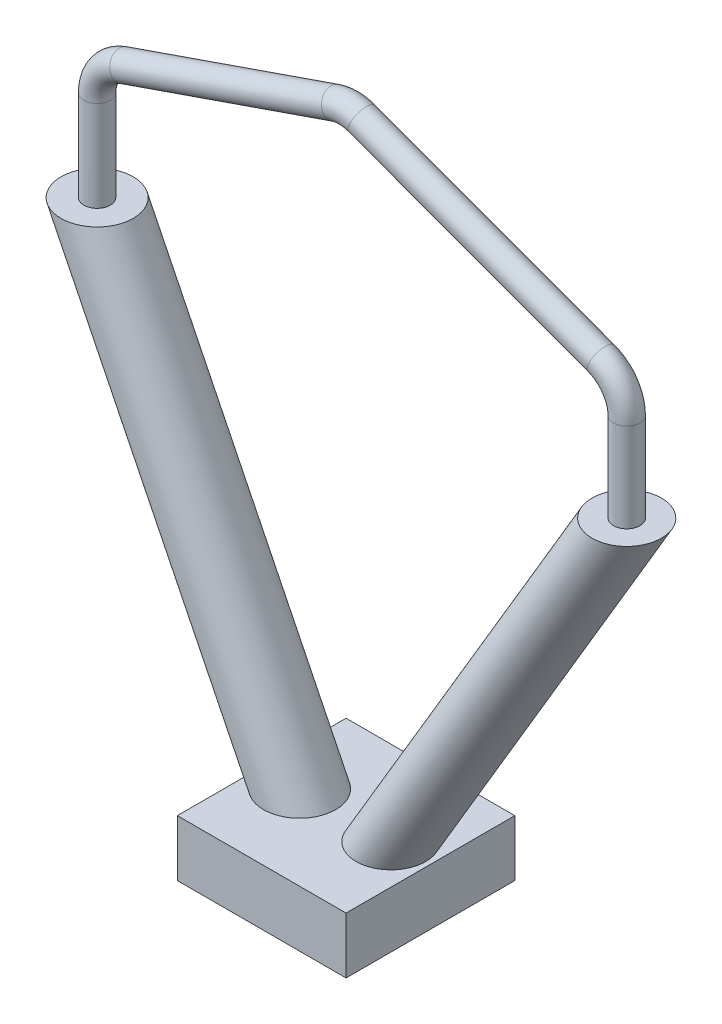
ISO-10303-21;
HEADER;
FILE_DESCRIPTION(('STEP AP214'),'2;1');
FILE_NAME('part.step','',(''),(''),'','','');
FILE_SCHEMA(('AUTOMOTIVE_DESIGN { 1 0 10303 214 1 1 1 1 }'));
ENDSEC;
DATA;
#1=APPLICATION_CONTEXT('core data for automotive mechanical design processes');
#2=APPLICATION_PROTOCOL_DEFINITION('international standard','automotive_design',2000,#1);
#3=PRODUCT_CONTEXT('',#1,'mechanical');
#4=PRODUCT('Part','Part','',(#3));
#5=PRODUCT_RELATED_PRODUCT_CATEGORY('part','',(#4));
#6=PRODUCT_DEFINITION_FORMATION('','',#4);
#7=PRODUCT_DEFINITION_CONTEXT('part definition',#1,'design');
#8=PRODUCT_DEFINITION('design','',#6,#7);
#9=PRODUCT_DEFINITION_SHAPE('','',#8);
#10=(LENGTH_UNIT() NAMED_UNIT(*) SI_UNIT(.MILLI.,.METRE.));
#11=(NAMED_UNIT(*) PLANE_ANGLE_UNIT() SI_UNIT($,.RADIAN.));
#12=(NAMED_UNIT(*) SI_UNIT($,.STERADIAN.) SOLID_ANGLE_UNIT());
#13=UNCERTAINTY_MEASURE_WITH_UNIT(LENGTH_MEASURE(1.E-05),#10,'distance_accuracy_value','');
#14=(GEOMETRIC_REPRESENTATION_CONTEXT(3) GLOBAL_UNCERTAINTY_ASSIGNED_CONTEXT((#13)) GLOBAL_UNIT_ASSIGNED_CONTEXT((#10,
#11,#12)) REPRESENTATION_CONTEXT('',''));
#15=CARTESIAN_POINT('',(0.,0.,0.));
#16=DIRECTION('',(0.,0.,1.));
#17=DIRECTION('',(1.,0.,0.));
#18=AXIS2_PLACEMENT_3D('',#15,#16,#17);
#19=CARTESIAN_POINT('',(150.,100.,-150.));
#20=DIRECTION('',(-1.,0.,0.));
#21=DIRECTION('',(0.,0.,1.));
#22=AXIS2_PLACEMENT_3D('',#19,#20,#21);
#23=PLANE('',#22);
#24=DIRECTION('',(0.,0.,-1.));
#25=VECTOR('',#24,1.);
#26=CARTESIAN_POINT('',(150.,0.,-150.));
#27=LINE('',#26,#25);
#28=CARTESIAN_POINT('',(150.,0.,150.));
#29=VERTEX_POINT('',#28);
#30=CARTESIAN_POINT('',(150.,0.,-150.));
#31=VERTEX_POINT('',#30);
#32=EDGE_CURVE('E110',#29,#31,#27,.T.);
#33=ORIENTED_EDGE('',*,*,#32,.T.);
#34=DIRECTION('',(0.,-1.,0.));
#35=VECTOR('',#34,1.);
#36=CARTESIAN_POINT('',(150.,100.,-150.));
#37=LINE('',#36,#35);
#38=CARTESIAN_POINT('',(150.,100.,-150.));
#39=VERTEX_POINT('',#38);
#40=EDGE_CURVE('E135',#39,#31,#37,.T.);
#41=ORIENTED_EDGE('',*,*,#40,.F.);
#42=DIRECTION('',(0.,0.,-1.));
#43=VECTOR('',#42,1.);
#44=CARTESIAN_POINT('',(150.,100.,-150.));
#45=LINE('',#44,#43);
#46=CARTESIAN_POINT('',(150.,100.,150.));
#47=VERTEX_POINT('',#46);
#48=EDGE_CURVE('E117',#47,#39,#45,.T.);
#49=ORIENTED_EDGE('',*,*,#48,.F.);
#50=DIRECTION('',(0.,-1.,0.));
#51=VECTOR('',#50,1.);
#52=CARTESIAN_POINT('',(150.,100.,150.));
#53=LINE('',#52,#51);
#54=EDGE_CURVE('E123',#47,#29,#53,.T.);
#55=ORIENTED_EDGE('',*,*,#54,.T.);
#56=EDGE_LOOP('',(#33,#41,#49,#55));
#57=FACE_BOUND('',#56,.T.);
#58=ADVANCED_FACE('F47',(#57),#23,.F.);
#59=CARTESIAN_POINT('',(-150.,100.,-150.));
#60=DIRECTION('',(0.,0.,1.));
#61=DIRECTION('',(1.,0.,0.));
#62=AXIS2_PLACEMENT_3D('',#59,#60,#61);
#63=PLANE('',#62);
#64=DIRECTION('',(-1.,0.,0.));
#65=VECTOR('',#64,1.);
#66=CARTESIAN_POINT('',(-150.,0.,-150.));
#67=LINE('',#66,#65);
#68=CARTESIAN_POINT('',(-150.,0.,-150.));
#69=VERTEX_POINT('',#68);
#70=EDGE_CURVE('E126',#31,#69,#67,.T.);
#71=ORIENTED_EDGE('',*,*,#70,.T.);
#72=DIRECTION('',(0.,-1.,0.));
#73=VECTOR('',#72,1.);
#74=CARTESIAN_POINT('',(-150.,100.,-150.));
#75=LINE('',#74,#73);
#76=CARTESIAN_POINT('',(-150.,100.,-150.));
#77=VERTEX_POINT('',#76);
#78=EDGE_CURVE('E133',#77,#69,#75,.T.);
#79=ORIENTED_EDGE('',*,*,#78,.F.);
#80=DIRECTION('',(-1.,0.,0.));
#81=VECTOR('',#80,1.);
#82=CARTESIAN_POINT('',(-150.,100.,-150.));
#83=LINE('',#82,#81);
#84=EDGE_CURVE('E96',#39,#77,#83,.T.);
#85=ORIENTED_EDGE('',*,*,#84,.F.);
#86=ORIENTED_EDGE('',*,*,#40,.T.);
#87=EDGE_LOOP('',(#71,#79,#85,#86));
#88=FACE_BOUND('',#87,.T.);
#89=ADVANCED_FACE('F155',(#88),#63,.F.);
#90=CARTESIAN_POINT('',(-150.,100.,-150.));
#91=DIRECTION('',(1.,0.,0.));
#92=DIRECTION('',(0.,0.,-1.));
#93=AXIS2_PLACEMENT_3D('',#90,#91,#92);
#94=PLANE('',#93);
#95=DIRECTION('',(0.,0.,1.));
#96=VECTOR('',#95,1.);
#97=CARTESIAN_POINT('',(-150.,0.,-150.));
#98=LINE('',#97,#96);
#99=CARTESIAN_POINT('',(-150.,0.,150.));
#100=VERTEX_POINT('',#99);
#101=EDGE_CURVE('E82',#69,#100,#98,.T.);
#102=ORIENTED_EDGE('',*,*,#101,.T.);
#103=DIRECTION('',(0.,-1.,0.));
#104=VECTOR('',#103,1.);
#105=CARTESIAN_POINT('',(-150.,100.,150.));
#106=LINE('',#105,#104);
#107=CARTESIAN_POINT('',(-150.,100.,150.));
#108=VERTEX_POINT('',#107);
#109=EDGE_CURVE('E131',#108,#100,#106,.T.);
#110=ORIENTED_EDGE('',*,*,#109,.F.);
#111=DIRECTION('',(0.,0.,1.));
#112=VECTOR('',#111,1.);
#113=CARTESIAN_POINT('',(-150.,100.,-150.));
#114=LINE('',#113,#112);
#115=EDGE_CURVE('E120',#77,#108,#114,.T.);
#116=ORIENTED_EDGE('',*,*,#115,.F.);
#117=ORIENTED_EDGE('',*,*,#78,.T.);
#118=EDGE_LOOP('',(#102,#110,#116,#117));
#119=FACE_BOUND('',#118,.T.);
#120=ADVANCED_FACE('F158',(#119),#94,.F.);
#121=CARTESIAN_POINT('',(-150.,100.,150.));
#122=DIRECTION('',(0.,0.,-1.));
#123=DIRECTION('',(-1.,0.,0.));
#124=AXIS2_PLACEMENT_3D('',#121,#122,#123);
#125=PLANE('',#124);
#126=DIRECTION('',(1.,0.,0.));
#127=VECTOR('',#126,1.);
#128=CARTESIAN_POINT('',(-150.,0.,150.));
#129=LINE('',#128,#127);
#130=EDGE_CURVE('E88',#100,#29,#129,.T.);
#131=ORIENTED_EDGE('',*,*,#130,.T.);
#132=ORIENTED_EDGE('',*,*,#54,.F.);
#133=DIRECTION('',(1.,0.,0.));
#134=VECTOR('',#133,1.);
#135=CARTESIAN_POINT('',(-150.,100.,150.));
#136=LINE('',#135,#134);
#137=EDGE_CURVE('E64',#108,#47,#136,.T.);
#138=ORIENTED_EDGE('',*,*,#137,.F.);
#139=ORIENTED_EDGE('',*,*,#109,.T.);
#140=EDGE_LOOP('',(#131,#132,#138,#139));
#141=FACE_BOUND('',#140,.T.);
#142=ADVANCED_FACE('F149',(#141),#125,.F.);
#143=CARTESIAN_POINT('',(0.,100.,0.));
#144=DIRECTION('',(0.,1.,0.));
#145=DIRECTION('',(0.,0.,1.));
#146=AXIS2_PLACEMENT_3D('',#143,#144,#145);
#147=PLANE('',#146);
#148=CARTESIAN_POINT('',(-82.5763052818377,100.,0.));
#149=DIRECTION('',(0.,1.,0.));
#150=DIRECTION('',(0.,0.,1.));
#151=AXIS2_PLACEMENT_3D('',#148,#149,#150);
#152=CIRCLE('',#151,64.1383141800667);
#153=CARTESIAN_POINT('',(-82.5763052818377,100.,64.1383141800667));
#154=VERTEX_POINT('',#153);
#155=EDGE_CURVE('E50',#154,#154,#152,.T.);
#156=ORIENTED_EDGE('',*,*,#155,.F.);
#157=EDGE_LOOP('',(#156));
#158=FACE_BOUND('',#157,.T.);
#159=CARTESIAN_POINT('',(79.7197196387326,100.,0.));
#160=DIRECTION('',(0.,1.,0.));
#161=DIRECTION('',(0.,0.,1.));
#162=AXIS2_PLACEMENT_3D('',#159,#160,#161);
#163=CIRCLE('',#162,61.7577937173229);
#164=CARTESIAN_POINT('',(79.7197196387326,100.,61.7577937173229));
#165=VERTEX_POINT('',#164);
#166=EDGE_CURVE('E136',#165,#165,#163,.T.);
#167=ORIENTED_EDGE('',*,*,#166,.F.);
#168=EDGE_LOOP('',(#167));
#169=FACE_BOUND('',#168,.T.);
#170=ORIENTED_EDGE('',*,*,#48,.T.);
#171=ORIENTED_EDGE('',*,*,#84,.T.);
#172=ORIENTED_EDGE('',*,*,#115,.T.);
#173=ORIENTED_EDGE('',*,*,#137,.T.);
#174=EDGE_LOOP('',(#170,#171,#172,#173));
#175=FACE_BOUND('',#174,.T.);
#176=ADVANCED_FACE('F145',(#158,#169,#175),#147,.T.);
#177=CARTESIAN_POINT('',(0.,0.,0.));
#178=DIRECTION('',(0.,1.,0.));
#179=DIRECTION('',(0.,0.,1.));
#180=AXIS2_PLACEMENT_3D('',#177,#178,#179);
#181=PLANE('',#180);
#182=ORIENTED_EDGE('',*,*,#32,.F.);
#183=ORIENTED_EDGE('',*,*,#130,.F.);
#184=ORIENTED_EDGE('',*,*,#101,.F.);
#185=ORIENTED_EDGE('',*,*,#70,.F.);
#186=EDGE_LOOP('',(#182,#183,#184,#185));
#187=FACE_BOUND('',#186,.T.);
#188=ADVANCED_FACE('F148',(#187),#181,.F.);
#189=CARTESIAN_POINT('',(499.0174425543,807.657749642575,2.18473481928987E-12));
#190=DIRECTION('',(0.,1.,0.));
#191=DIRECTION('',(0.,0.,1.));
#192=AXIS2_PLACEMENT_3D('',#189,#190,#191);
#193=PLANE('',#192);
#194=CARTESIAN_POINT('',(499.0174425543,807.657749642575,2.18473481928987E-12));
#195=DIRECTION('',(0.,1.,0.));
#196=DIRECTION('',(0.,0.,1.));
#197=AXIS2_PLACEMENT_3D('',#194,#195,#196);
#198=CIRCLE('',#197,23.4986262950645);
#199=CARTESIAN_POINT('',(499.0174425543,807.657749642575,23.4986262950667));
#200=VERTEX_POINT('',#199);
#201=EDGE_CURVE('E13',#200,#200,#198,.T.);
#202=ORIENTED_EDGE('',*,*,#201,.F.);
#203=EDGE_LOOP('',(#202));
#204=FACE_BOUND('',#203,.T.);
#205=CARTESIAN_POINT('',(499.0174425543,807.657749642575,2.18473481928987E-12));
#206=DIRECTION('',(0.,1.,0.));
#207=DIRECTION('',(0.,0.,1.));
#208=AXIS2_PLACEMENT_3D('',#205,#206,#207);
#209=CIRCLE('',#208,61.7577937173229);
#210=CARTESIAN_POINT('',(499.0174425543,807.657749642575,61.7577937173251));
#211=VERTEX_POINT('',#210);
#212=EDGE_CURVE('E107',#211,#211,#209,.T.);
#213=ORIENTED_EDGE('',*,*,#212,.T.);
#214=EDGE_LOOP('',(#213));
#215=FACE_BOUND('',#214,.T.);
#216=ADVANCED_FACE('F160',(#204,#215),#193,.T.);
#217=CARTESIAN_POINT('',(79.7197196387326,100.,61.7577937173229));
#218=CARTESIAN_POINT('',(499.0174425543,807.657749642575,61.7577937173251));
#219=CARTESIAN_POINT('',(203.235307073378,100.,61.7577937173229));
#220=CARTESIAN_POINT('',(622.533029988946,807.657749642575,61.7577937173251));
#221=CARTESIAN_POINT('',(203.235307073378,100.,-61.7577937173229));
#222=CARTESIAN_POINT('',(622.533029988946,807.657749642575,-61.7577937173207));
#223=CARTESIAN_POINT('',(79.7197196387326,100.,-61.7577937173229));
#224=CARTESIAN_POINT('',(499.0174425543,807.657749642575,-61.7577937173207));
#225=CARTESIAN_POINT('',(-43.7958677959131,100.,-61.7577937173229));
#226=CARTESIAN_POINT('',(375.501855119654,807.657749642575,-61.7577937173207));
#227=CARTESIAN_POINT('',(-43.7958677959131,100.,61.7577937173229));
#228=CARTESIAN_POINT('',(375.501855119654,807.657749642575,61.7577937173251));
#229=CARTESIAN_POINT('',(79.7197196387326,100.,61.7577937173229));
#230=CARTESIAN_POINT('',(499.0174425543,807.657749642575,61.7577937173251));
#231=(BOUNDED_SURFACE() B_SPLINE_SURFACE(3,1,((#217,#218),(#219,#220),(#221,#222),(#223,#224),
(#225,#226),(#227,#228),(#229,#230)),.UNSPECIFIED.,.T.,.F.,.F.) B_SPLINE_SURFACE_WITH_KNOTS((4,
3,4),(2,2),(0.,0.5,1.),(0.,1.),
.UNSPECIFIED.) GEOMETRIC_REPRESENTATION_ITEM() RATIONAL_B_SPLINE_SURFACE(((1.,1.),
(0.333333333333333,0.333333333333333),(0.333333333333333,0.333333333333333),(1.,1.),
(0.333333333333333,0.333333333333333),(0.333333333333333,0.333333333333333),(1.,1.))) REPRESENTATION_ITEM('') SURFACE());
#232=ORIENTED_EDGE('',*,*,#212,.F.);
#233=EDGE_LOOP('',(#232));
#234=FACE_BOUND('',#233,.T.);
#235=ORIENTED_EDGE('',*,*,#166,.T.);
#236=EDGE_LOOP('',(#235));
#237=FACE_BOUND('',#236,.T.);
#238=ADVANCED_FACE('F162',(#234,#237),#231,.T.);
#239=CARTESIAN_POINT('',(-442.652634805131,830.366298789155,2.31353072319635E-12));
#240=DIRECTION('',(0.,1.,0.));
#241=DIRECTION('',(0.,0.,1.));
#242=AXIS2_PLACEMENT_3D('',#239,#240,#241);
#243=PLANE('',#242);
#244=CARTESIAN_POINT('',(-442.652634805131,830.366298789155,2.31353072319635E-12));
#245=DIRECTION('',(0.,-1.,0.));
#246=DIRECTION('',(0.,0.,1.));
#247=AXIS2_PLACEMENT_3D('',#244,#245,#246);
#248=CIRCLE('',#247,23.4986262950645);
#249=CARTESIAN_POINT('',(-442.652634805131,830.366298789156,23.4986262950668));
#250=VERTEX_POINT('',#249);
#251=EDGE_CURVE('E108',#250,#250,#248,.T.);
#252=ORIENTED_EDGE('',*,*,#251,.T.);
#253=EDGE_LOOP('',(#252));
#254=FACE_BOUND('',#253,.T.);
#255=CARTESIAN_POINT('',(-442.652634805131,830.366298789155,2.31353072319635E-12));
#256=DIRECTION('',(0.,1.,0.));
#257=DIRECTION('',(0.,0.,1.));
#258=AXIS2_PLACEMENT_3D('',#255,#256,#257);
#259=CIRCLE('',#258,64.1383141800667);
#260=CARTESIAN_POINT('',(-442.652634805131,830.366298789155,64.138314180069));
#261=VERTEX_POINT('',#260);
#262=EDGE_CURVE('E104',#261,#261,#259,.T.);
#263=ORIENTED_EDGE('',*,*,#262,.T.);
#264=EDGE_LOOP('',(#263));
#265=FACE_BOUND('',#264,.T.);
#266=ADVANCED_FACE('F105',(#254,#265),#243,.T.);
#267=CARTESIAN_POINT('',(-82.5763052818377,100.,64.1383141800667));
#268=CARTESIAN_POINT('',(-442.652634805131,830.366298789155,64.138314180069));
#269=CARTESIAN_POINT('',(45.7003230782957,100.,64.1383141800667));
#270=CARTESIAN_POINT('',(-314.376006444998,830.366298789155,64.138314180069));
#271=CARTESIAN_POINT('',(45.7003230782957,100.,-64.1383141800667));
#272=CARTESIAN_POINT('',(-314.376006444998,830.366298789155,-64.1383141800644));
#273=CARTESIAN_POINT('',(-82.5763052818377,100.,-64.1383141800667));
#274=CARTESIAN_POINT('',(-442.652634805131,830.366298789155,-64.1383141800644));
#275=CARTESIAN_POINT('',(-210.852933641971,100.,-64.1383141800667));
#276=CARTESIAN_POINT('',(-570.929263165265,830.366298789155,-64.1383141800644));
#277=CARTESIAN_POINT('',(-210.852933641971,100.,64.1383141800667));
#278=CARTESIAN_POINT('',(-570.929263165265,830.366298789155,64.138314180069));
#279=CARTESIAN_POINT('',(-82.5763052818377,100.,64.1383141800667));
#280=CARTESIAN_POINT('',(-442.652634805131,830.366298789155,64.138314180069));
#281=(BOUNDED_SURFACE() B_SPLINE_SURFACE(3,1,((#267,#268),(#269,#270),(#271,#272),(#273,#274),
(#275,#276),(#277,#278),(#279,#280)),.UNSPECIFIED.,.T.,.F.,.F.) B_SPLINE_SURFACE_WITH_KNOTS((4,
3,4),(2,2),(0.,0.5,1.),(0.,1.),
.UNSPECIFIED.) GEOMETRIC_REPRESENTATION_ITEM() RATIONAL_B_SPLINE_SURFACE(((1.,1.),
(0.333333333333333,0.333333333333333),(0.333333333333333,0.333333333333333),(1.,1.),
(0.333333333333333,0.333333333333333),(0.333333333333333,0.333333333333333),(1.,1.))) REPRESENTATION_ITEM('') SURFACE());
#282=ORIENTED_EDGE('',*,*,#262,.F.);
#283=EDGE_LOOP('',(#282));
#284=FACE_BOUND('',#283,.T.);
#285=ORIENTED_EDGE('',*,*,#155,.T.);
#286=EDGE_LOOP('',(#285));
#287=FACE_BOUND('',#286,.T.);
#288=ADVANCED_FACE('F143',(#284,#287),#281,.T.);
#289=CARTESIAN_POINT('',(499.0174425543,807.657749642575,2.18473481928987E-12));
#290=DIRECTION('',(0.,1.,0.));
#291=DIRECTION('',(0.,0.,1.));
#292=AXIS2_PLACEMENT_3D('',#289,#290,#291);
#293=CYLINDRICAL_SURFACE('',#292,23.4986262950645);
#294=CARTESIAN_POINT('',(499.0174425543,965.743179521314,5.15710336395529E-13));
#295=DIRECTION('',(0.,1.,0.));
#296=DIRECTION('',(0.,0.,1.));
#297=AXIS2_PLACEMENT_3D('',#294,#295,#296);
#298=CIRCLE('',#297,23.4986262950645);
#299=CARTESIAN_POINT('',(522.516068849364,965.743179521314,3.28698720297666E-12));
#300=VERTEX_POINT('',#299);
#301=EDGE_CURVE('E321',#300,#300,#298,.T.);
#302=ORIENTED_EDGE('',*,*,#301,.F.);
#303=EDGE_LOOP('',(#302));
#304=FACE_BOUND('',#303,.T.);
#305=ORIENTED_EDGE('',*,*,#201,.T.);
#306=EDGE_LOOP('',(#305));
#307=FACE_BOUND('',#306,.T.);
#308=ADVANCED_FACE('F202',(#304,#307),#293,.T.);
#309=CARTESIAN_POINT('',(429.0174425543,965.743179521314,-7.73963949660402E-12));
#310=DIRECTION('',(0.,0.,1.));
#311=DIRECTION('',(1.,0.,0.));
#312=AXIS2_PLACEMENT_3D('',#309,#310,#311);
#313=TOROIDAL_SURFACE('',#312,70.,23.4986262950645);
#314=CARTESIAN_POINT('',(453.170648011251,1031.44418914943,7.87399073533711E-13));
#315=DIRECTION('',(-0.938585851830284,0.34504579224216,0.));
#316=DIRECTION('',(0.,0.,1.));
#317=AXIS2_PLACEMENT_3D('',#314,#315,#316);
#318=CIRCLE('',#317,23.4986262950645);
#319=CARTESIAN_POINT('',(461.278750137834,1053.49966732743,3.64988039872324E-12));
#320=VERTEX_POINT('',#319);
#321=EDGE_CURVE('E318',#320,#320,#318,.T.);
#322=CARTESIAN_POINT('',(429.0174425543,965.743179521314,-7.73963949660402E-12));
#323=DIRECTION('',(0.,0.,1.));
#324=DIRECTION('',(1.,0.,0.));
#325=AXIS2_PLACEMENT_3D('',#322,#323,#324);
#326=CIRCLE('',#325,93.4986262950644);
#327=EDGE_CURVE('',#300,#320,#326,.T.);
#328=ORIENTED_EDGE('',*,*,#301,.T.);
#329=ORIENTED_EDGE('',*,*,#321,.F.);
#330=ORIENTED_EDGE('',*,*,#327,.T.);
#331=ORIENTED_EDGE('',*,*,#327,.F.);
#332=EDGE_LOOP('',(#328,#330,#329,#331));
#333=FACE_BOUND('',#332,.T.);
#334=ADVANCED_FACE('F227',(#333),#313,.T.);
#335=CARTESIAN_POINT('',(453.170648011251,1031.44418914943,0.));
#336=DIRECTION('',(-0.938585851830284,0.34504579224216,0.));
#337=DIRECTION('',(-0.34504579224216,-0.938585851830285,0.));
#338=AXIS2_PLACEMENT_3D('',#335,#336,#337);
#339=CYLINDRICAL_SURFACE('',#338,23.4986262950645);
#340=CARTESIAN_POINT('',(27.9929332897321,1187.74931684097,0.));
#341=DIRECTION('',(-0.938585851830284,0.34504579224216,0.));
#342=DIRECTION('',(0.,0.,1.));
#343=AXIS2_PLACEMENT_3D('',#340,#341,#342);
#344=CIRCLE('',#343,23.4986262950645);
#345=CARTESIAN_POINT('',(36.101035416315,1209.80479501896,0.));
#346=VERTEX_POINT('',#345);
#347=EDGE_CURVE('E315',#346,#346,#344,.T.);
#348=ORIENTED_EDGE('',*,*,#347,.F.);
#349=EDGE_LOOP('',(#348));
#350=FACE_BOUND('',#349,.T.);
#351=ORIENTED_EDGE('',*,*,#321,.T.);
#352=EDGE_LOOP('',(#351));
#353=FACE_BOUND('',#352,.T.);
#354=ADVANCED_FACE('F237',(#350,#353),#339,.T.);
#355=CARTESIAN_POINT('',(3.83972783278103,1122.04830721285,0.));
#356=DIRECTION('',(0.,0.,1.));
#357=DIRECTION('',(1.,0.,0.));
#358=AXIS2_PLACEMENT_3D('',#355,#356,#357);
#359=TOROIDAL_SURFACE('',#358,70.,23.4986262950645);
#360=CARTESIAN_POINT('',(-19.0540602204565,1188.19870002025,0.));
#361=DIRECTION('',(-0.945005611534299,-0.32705411504625,0.));
#362=DIRECTION('',(0.,0.,1.));
#363=AXIS2_PLACEMENT_3D('',#360,#361,#362);
#364=CIRCLE('',#363,23.4986262950645);
#365=CARTESIAN_POINT('',(-26.7393826481913,1210.40503373243,0.));
#366=VERTEX_POINT('',#365);
#367=EDGE_CURVE('E310',#366,#366,#364,.T.);
#368=CARTESIAN_POINT('',(3.83972783278103,1122.04830721285,0.));
#369=DIRECTION('',(0.,0.,1.));
#370=DIRECTION('',(1.,0.,0.));
#371=AXIS2_PLACEMENT_3D('',#368,#369,#370);
#372=CIRCLE('',#371,93.4986262950644);
#373=EDGE_CURVE('',#346,#366,#372,.T.);
#374=ORIENTED_EDGE('',*,*,#347,.T.);
#375=ORIENTED_EDGE('',*,*,#367,.F.);
#376=ORIENTED_EDGE('',*,*,#373,.T.);
#377=ORIENTED_EDGE('',*,*,#373,.F.);
#378=EDGE_LOOP('',(#374,#376,#375,#377));
#379=FACE_BOUND('',#378,.T.);
#380=ADVANCED_FACE('F247',(#379),#359,.T.);
#381=CARTESIAN_POINT('',(-19.0540602204565,1188.19870002025,0.));
#382=DIRECTION('',(-0.945005611534299,-0.327054115046249,0.));
#383=DIRECTION('',(0.327054115046249,-0.945005611534299,0.));
#384=AXIS2_PLACEMENT_3D('',#381,#382,#383);
#385=CYLINDRICAL_SURFACE('',#384,23.4986262950645);
#386=CARTESIAN_POINT('',(-395.546422858369,1057.89960445795,0.));
#387=DIRECTION('',(-0.945005611534299,-0.327054115046249,0.));
#388=DIRECTION('',(0.,0.,1.));
#389=AXIS2_PLACEMENT_3D('',#386,#387,#388);
#390=CIRCLE('',#389,23.4986262950645);
#391=CARTESIAN_POINT('',(-403.231745286103,1080.10593817013,-2.72349644818409E-13));
#392=VERTEX_POINT('',#391);
#393=EDGE_CURVE('E308',#392,#392,#390,.T.);
#394=ORIENTED_EDGE('',*,*,#393,.F.);
#395=EDGE_LOOP('',(#394));
#396=FACE_BOUND('',#395,.T.);
#397=ORIENTED_EDGE('',*,*,#367,.T.);
#398=EDGE_LOOP('',(#397));
#399=FACE_BOUND('',#398,.T.);
#400=ADVANCED_FACE('F257',(#396,#399),#385,.T.);
#401=CARTESIAN_POINT('',(-372.652634805131,991.74921165055,8.11301686230604E-13));
#402=DIRECTION('',(0.,0.,1.));
#403=DIRECTION('',(1.,0.,0.));
#404=AXIS2_PLACEMENT_3D('',#401,#402,#403);
#405=TOROIDAL_SURFACE('',#404,70.,23.4986262950645);
#406=CARTESIAN_POINT('',(-442.652634805131,991.74921165055,8.11301686230604E-13));
#407=DIRECTION('',(0.,-1.,0.));
#408=DIRECTION('',(0.,0.,1.));
#409=AXIS2_PLACEMENT_3D('',#406,#407,#408);
#410=CIRCLE('',#409,23.4986262950645);
#411=CARTESIAN_POINT('',(-466.151261100196,991.74921165055,8.11301686230604E-13));
#412=VERTEX_POINT('',#411);
#413=EDGE_CURVE('E113',#412,#412,#410,.T.);
#414=CARTESIAN_POINT('',(-372.652634805131,991.74921165055,8.11301686230604E-13));
#415=DIRECTION('',(0.,0.,1.));
#416=DIRECTION('',(1.,0.,0.));
#417=AXIS2_PLACEMENT_3D('',#414,#415,#416);
#418=CIRCLE('',#417,93.4986262950645);
#419=EDGE_CURVE('',#392,#412,#418,.T.);
#420=ORIENTED_EDGE('',*,*,#393,.T.);
#421=ORIENTED_EDGE('',*,*,#413,.F.);
#422=ORIENTED_EDGE('',*,*,#419,.T.);
#423=ORIENTED_EDGE('',*,*,#419,.F.);
#424=EDGE_LOOP('',(#420,#422,#421,#423));
#425=FACE_BOUND('',#424,.T.);
#426=ADVANCED_FACE('F267',(#425),#405,.T.);
#427=CARTESIAN_POINT('',(-442.652634805131,991.74921165055,5.45962131204923E-13));
#428=DIRECTION('',(0.,-1.,0.));
#429=DIRECTION('',(0.,0.,-1.));
#430=AXIS2_PLACEMENT_3D('',#427,#428,#429);
#431=CYLINDRICAL_SURFACE('',#430,23.4986262950645);
#432=ORIENTED_EDGE('',*,*,#251,.F.);
#433=EDGE_LOOP('',(#432));
#434=FACE_BOUND('',#433,.T.);
#435=ORIENTED_EDGE('',*,*,#413,.T.);
#436=EDGE_LOOP('',(#435));
#437=FACE_BOUND('',#436,.T.);
#438=ADVANCED_FACE('F221',(#434,#437),#431,.T.);
#439=CLOSED_SHELL('',(#58,#89,#120,#142,#176,#188,#216,#238,#266,#288,#308,#334,#354,#380,#400,
#426,#438));
#440=MANIFOLD_SOLID_BREP('B2',#439);
#441=ADVANCED_BREP_SHAPE_REPRESENTATION('',(#18,#440),#14);
#442=SHAPE_DEFINITION_REPRESENTATION(#9,#441);
ENDSEC;
END-ISO-10303-21;
